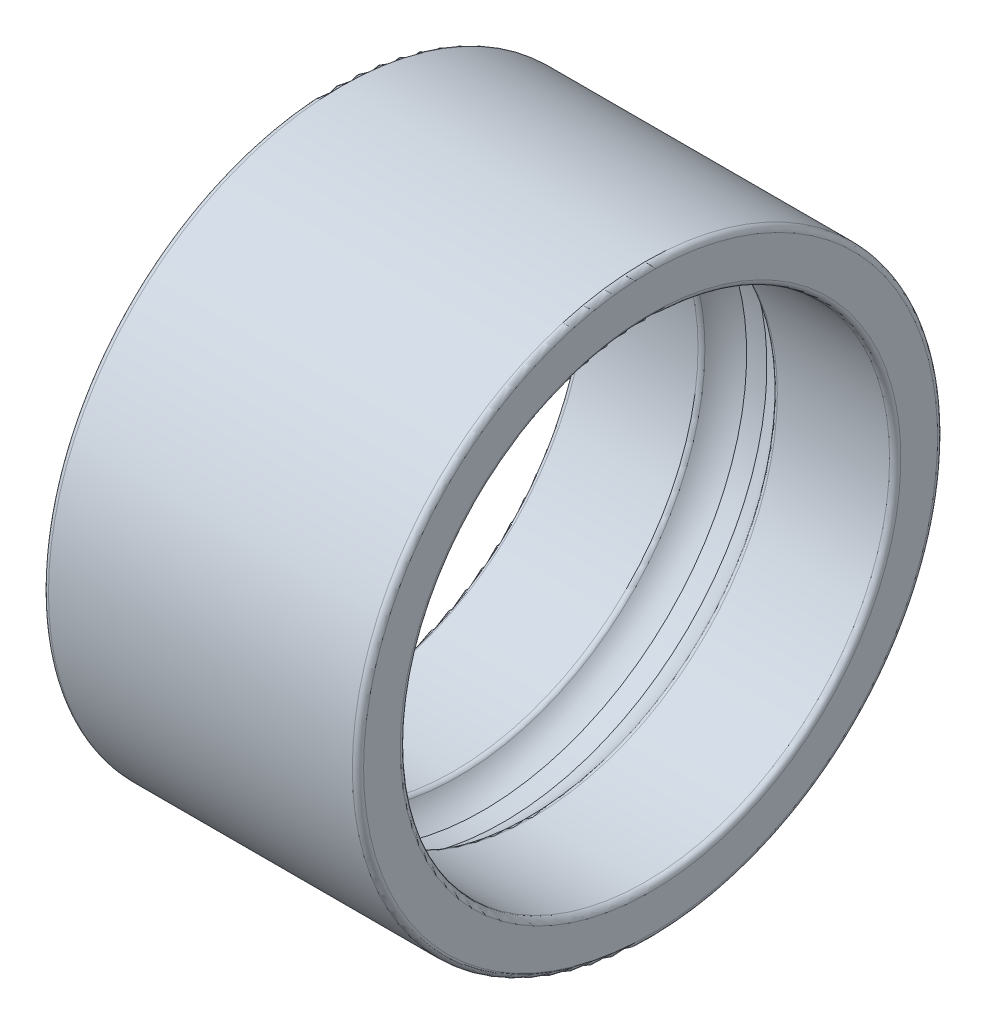
ISO-10303-21;
HEADER;
FILE_DESCRIPTION(('STEP AP214'),'2;1');
FILE_NAME('part.step','',(''),(''),'','','');
FILE_SCHEMA(('AUTOMOTIVE_DESIGN { 1 0 10303 214 1 1 1 1 }'));
ENDSEC;
DATA;
#1=APPLICATION_CONTEXT('core data for automotive mechanical design processes');
#2=APPLICATION_PROTOCOL_DEFINITION('international standard','automotive_design',2000,#1);
#3=PRODUCT_CONTEXT('',#1,'mechanical');
#4=PRODUCT('Part','Part','',(#3));
#5=PRODUCT_RELATED_PRODUCT_CATEGORY('part','',(#4));
#6=PRODUCT_DEFINITION_FORMATION('','',#4);
#7=PRODUCT_DEFINITION_CONTEXT('part definition',#1,'design');
#8=PRODUCT_DEFINITION('design','',#6,#7);
#9=PRODUCT_DEFINITION_SHAPE('','',#8);
#10=(LENGTH_UNIT() NAMED_UNIT(*) SI_UNIT(.MILLI.,.METRE.));
#11=(NAMED_UNIT(*) PLANE_ANGLE_UNIT() SI_UNIT($,.RADIAN.));
#12=(NAMED_UNIT(*) SI_UNIT($,.STERADIAN.) SOLID_ANGLE_UNIT());
#13=UNCERTAINTY_MEASURE_WITH_UNIT(LENGTH_MEASURE(1.E-05),#10,'distance_accuracy_value','');
#14=(GEOMETRIC_REPRESENTATION_CONTEXT(3) GLOBAL_UNCERTAINTY_ASSIGNED_CONTEXT((#13)) GLOBAL_UNIT_ASSIGNED_CONTEXT((#10,
#11,#12)) REPRESENTATION_CONTEXT('',''));
#15=CARTESIAN_POINT('',(0.,0.,0.));
#16=DIRECTION('',(0.,0.,1.));
#17=DIRECTION('',(1.,0.,0.));
#18=AXIS2_PLACEMENT_3D('',#15,#16,#17);
#19=CARTESIAN_POINT('',(0.,0.,0.));
#20=DIRECTION('',(-1.,0.,0.));
#21=DIRECTION('',(0.,0.,1.));
#22=AXIS2_PLACEMENT_3D('',#19,#20,#21);
#23=CYLINDRICAL_SURFACE('',#22,10.87);
#24=CARTESIAN_POINT('',(5.23794864059996,0.,0.));
#25=DIRECTION('',(1.,0.,0.));
#26=DIRECTION('',(0.,0.,-1.));
#27=AXIS2_PLACEMENT_3D('',#24,#25,#26);
#28=CIRCLE('',#27,10.87);
#29=CARTESIAN_POINT('',(5.23794864059996,0.,-10.87));
#30=VERTEX_POINT('',#29);
#31=EDGE_CURVE('E80',#30,#30,#28,.T.);
#32=ORIENTED_EDGE('',*,*,#31,.T.);
#33=EDGE_LOOP('',(#32));
#34=FACE_BOUND('',#33,.T.);
#35=CARTESIAN_POINT('',(0.25,0.,0.));
#36=DIRECTION('',(1.,0.,0.));
#37=DIRECTION('',(0.,0.,-1.));
#38=AXIS2_PLACEMENT_3D('',#35,#36,#37);
#39=CIRCLE('',#38,10.87);
#40=CARTESIAN_POINT('',(0.25,0.,-10.87));
#41=VERTEX_POINT('',#40);
#42=EDGE_CURVE('E84',#41,#41,#39,.F.);
#43=ORIENTED_EDGE('',*,*,#42,.T.);
#44=EDGE_LOOP('',(#43));
#45=FACE_BOUND('',#44,.T.);
#46=ADVANCED_FACE('F36',(#34,#45),#23,.F.);
#47=CARTESIAN_POINT('',(0.,10.87,0.));
#48=DIRECTION('',(1.,0.,0.));
#49=DIRECTION('',(0.,0.,-1.));
#50=AXIS2_PLACEMENT_3D('',#47,#48,#49);
#51=PLANE('',#50);
#52=CARTESIAN_POINT('',(0.,0.,0.));
#53=DIRECTION('',(1.,0.,0.));
#54=DIRECTION('',(0.,0.,-1.));
#55=AXIS2_PLACEMENT_3D('',#52,#53,#54);
#56=CIRCLE('',#55,11.12);
#57=CARTESIAN_POINT('',(0.,0.,-11.12));
#58=VERTEX_POINT('',#57);
#59=EDGE_CURVE('E49',#58,#58,#56,.T.);
#60=ORIENTED_EDGE('',*,*,#59,.T.);
#61=EDGE_LOOP('',(#60));
#62=FACE_BOUND('',#61,.T.);
#63=CARTESIAN_POINT('',(0.,0.,0.));
#64=DIRECTION('',(1.,0.,0.));
#65=DIRECTION('',(0.,0.,-1.));
#66=AXIS2_PLACEMENT_3D('',#63,#64,#65);
#67=CIRCLE('',#66,12.75);
#68=CARTESIAN_POINT('',(0.,0.,-12.75));
#69=VERTEX_POINT('',#68);
#70=EDGE_CURVE('E54',#69,#69,#67,.F.);
#71=ORIENTED_EDGE('',*,*,#70,.T.);
#72=EDGE_LOOP('',(#71));
#73=FACE_BOUND('',#72,.T.);
#74=ADVANCED_FACE('F119',(#62,#73),#51,.F.);
#75=CARTESIAN_POINT('',(0.,0.,0.));
#76=DIRECTION('',(-1.,0.,0.));
#77=DIRECTION('',(0.,0.,1.));
#78=AXIS2_PLACEMENT_3D('',#75,#76,#77);
#79=CYLINDRICAL_SURFACE('',#78,13.);
#80=CARTESIAN_POINT('',(0.25,0.,0.));
#81=DIRECTION('',(1.,0.,0.));
#82=DIRECTION('',(0.,0.,-1.));
#83=AXIS2_PLACEMENT_3D('',#80,#81,#82);
#84=CIRCLE('',#83,13.);
#85=CARTESIAN_POINT('',(0.25,0.,-13.));
#86=VERTEX_POINT('',#85);
#87=EDGE_CURVE('E10',#86,#86,#84,.T.);
#88=ORIENTED_EDGE('',*,*,#87,.T.);
#89=EDGE_LOOP('',(#88));
#90=FACE_BOUND('',#89,.T.);
#91=CARTESIAN_POINT('',(13.75,0.,0.));
#92=DIRECTION('',(-1.,0.,0.));
#93=DIRECTION('',(0.,0.,1.));
#94=AXIS2_PLACEMENT_3D('',#91,#92,#93);
#95=CIRCLE('',#94,13.);
#96=CARTESIAN_POINT('',(13.75,0.,13.));
#97=VERTEX_POINT('',#96);
#98=EDGE_CURVE('E44',#97,#97,#95,.T.);
#99=ORIENTED_EDGE('',*,*,#98,.T.);
#100=EDGE_LOOP('',(#99));
#101=FACE_BOUND('',#100,.T.);
#102=ADVANCED_FACE('F125',(#90,#101),#79,.T.);
#103=CARTESIAN_POINT('',(14.,13.,0.));
#104=DIRECTION('',(-1.,0.,0.));
#105=DIRECTION('',(0.,0.,1.));
#106=AXIS2_PLACEMENT_3D('',#103,#104,#105);
#107=PLANE('',#106);
#108=CARTESIAN_POINT('',(14.,0.,0.));
#109=DIRECTION('',(-1.,0.,0.));
#110=DIRECTION('',(0.,0.,1.));
#111=AXIS2_PLACEMENT_3D('',#108,#109,#110);
#112=CIRCLE('',#111,11.12);
#113=CARTESIAN_POINT('',(14.,0.,11.12));
#114=VERTEX_POINT('',#113);
#115=EDGE_CURVE('E60',#114,#114,#112,.T.);
#116=ORIENTED_EDGE('',*,*,#115,.T.);
#117=EDGE_LOOP('',(#116));
#118=FACE_BOUND('',#117,.T.);
#119=CARTESIAN_POINT('',(14.,0.,0.));
#120=DIRECTION('',(-1.,0.,0.));
#121=DIRECTION('',(0.,0.,1.));
#122=AXIS2_PLACEMENT_3D('',#119,#120,#121);
#123=CIRCLE('',#122,12.75);
#124=CARTESIAN_POINT('',(14.,0.,12.75));
#125=VERTEX_POINT('',#124);
#126=EDGE_CURVE('E64',#125,#125,#123,.F.);
#127=ORIENTED_EDGE('',*,*,#126,.T.);
#128=EDGE_LOOP('',(#127));
#129=FACE_BOUND('',#128,.T.);
#130=ADVANCED_FACE('F156',(#118,#129),#107,.F.);
#131=CARTESIAN_POINT('',(0.,0.,0.));
#132=DIRECTION('',(-1.,0.,0.));
#133=DIRECTION('',(0.,0.,1.));
#134=AXIS2_PLACEMENT_3D('',#131,#132,#133);
#135=CYLINDRICAL_SURFACE('',#134,10.87);
#136=CARTESIAN_POINT('',(8.76205135940004,0.,0.));
#137=DIRECTION('',(1.,0.,0.));
#138=DIRECTION('',(0.,0.,-1.));
#139=AXIS2_PLACEMENT_3D('',#136,#137,#138);
#140=CIRCLE('',#139,10.87);
#141=CARTESIAN_POINT('',(8.76205135940004,0.,-10.87));
#142=VERTEX_POINT('',#141);
#143=EDGE_CURVE('E72',#142,#142,#140,.F.);
#144=ORIENTED_EDGE('',*,*,#143,.T.);
#145=EDGE_LOOP('',(#144));
#146=FACE_BOUND('',#145,.T.);
#147=CARTESIAN_POINT('',(13.75,0.,0.));
#148=DIRECTION('',(-1.,0.,0.));
#149=DIRECTION('',(0.,0.,1.));
#150=AXIS2_PLACEMENT_3D('',#147,#148,#149);
#151=CIRCLE('',#150,10.87);
#152=CARTESIAN_POINT('',(13.75,0.,10.87));
#153=VERTEX_POINT('',#152);
#154=EDGE_CURVE('E76',#153,#153,#151,.F.);
#155=ORIENTED_EDGE('',*,*,#154,.T.);
#156=EDGE_LOOP('',(#155));
#157=FACE_BOUND('',#156,.T.);
#158=ADVANCED_FACE('F158',(#146,#157),#135,.F.);
#159=CARTESIAN_POINT('',(7.,0.,0.));
#160=DIRECTION('',(-1.,0.,0.));
#161=DIRECTION('',(0.,0.,1.));
#162=AXIS2_PLACEMENT_3D('',#159,#160,#161);
#163=TOROIDAL_SURFACE('',#162,9.85347917236373,1.92);
#164=CARTESIAN_POINT('',(8.55905005071338,0.,0.));
#165=DIRECTION('',(-1.,0.,0.));
#166=DIRECTION('',(0.,0.,1.));
#167=AXIS2_PLACEMENT_3D('',#164,#165,#166);
#168=CIRCLE('',#167,10.9740874622539);
#169=CARTESIAN_POINT('',(8.55905005071338,0.,10.9740874622539));
#170=VERTEX_POINT('',#169);
#171=EDGE_CURVE('E68',#170,#170,#168,.F.);
#172=ORIENTED_EDGE('',*,*,#171,.T.);
#173=EDGE_LOOP('',(#172));
#174=FACE_BOUND('',#173,.T.);
#175=CARTESIAN_POINT('',(7.45,0.,0.));
#176=DIRECTION('',(-1.,0.,0.));
#177=DIRECTION('',(0.,0.,1.));
#178=AXIS2_PLACEMENT_3D('',#175,#176,#177);
#179=CIRCLE('',#178,11.72);
#180=CARTESIAN_POINT('',(7.45,0.,11.72));
#181=VERTEX_POINT('',#180);
#182=EDGE_CURVE('E92',#181,#181,#179,.T.);
#183=ORIENTED_EDGE('',*,*,#182,.T.);
#184=EDGE_LOOP('',(#183));
#185=FACE_BOUND('',#184,.T.);
#186=ADVANCED_FACE('F115',(#174,#185),#163,.F.);
#187=CARTESIAN_POINT('',(0.,0.,0.));
#188=DIRECTION('',(-1.,0.,0.));
#189=DIRECTION('',(0.,0.,1.));
#190=AXIS2_PLACEMENT_3D('',#187,#188,#189);
#191=CYLINDRICAL_SURFACE('',#190,11.72);
#192=ORIENTED_EDGE('',*,*,#182,.F.);
#193=EDGE_LOOP('',(#192));
#194=FACE_BOUND('',#193,.T.);
#195=CARTESIAN_POINT('',(6.55,0.,0.));
#196=DIRECTION('',(-1.,0.,0.));
#197=DIRECTION('',(0.,0.,1.));
#198=AXIS2_PLACEMENT_3D('',#195,#196,#197);
#199=CIRCLE('',#198,11.72);
#200=CARTESIAN_POINT('',(6.55,0.,11.72));
#201=VERTEX_POINT('',#200);
#202=EDGE_CURVE('E96',#201,#201,#199,.T.);
#203=ORIENTED_EDGE('',*,*,#202,.T.);
#204=EDGE_LOOP('',(#203));
#205=FACE_BOUND('',#204,.T.);
#206=ADVANCED_FACE('F101',(#194,#205),#191,.F.);
#207=CARTESIAN_POINT('',(7.,0.,0.));
#208=DIRECTION('',(-1.,0.,0.));
#209=DIRECTION('',(0.,0.,1.));
#210=AXIS2_PLACEMENT_3D('',#207,#208,#209);
#211=TOROIDAL_SURFACE('',#210,9.85347917236373,1.92);
#212=CARTESIAN_POINT('',(5.44094994928659,0.,0.));
#213=DIRECTION('',(1.,0.,0.));
#214=DIRECTION('',(0.,0.,-1.));
#215=AXIS2_PLACEMENT_3D('',#212,#213,#214);
#216=CIRCLE('',#215,10.9740874622539);
#217=CARTESIAN_POINT('',(5.44094994928659,0.,-10.9740874622539));
#218=VERTEX_POINT('',#217);
#219=EDGE_CURVE('E88',#218,#218,#216,.F.);
#220=ORIENTED_EDGE('',*,*,#219,.T.);
#221=EDGE_LOOP('',(#220));
#222=FACE_BOUND('',#221,.T.);
#223=ORIENTED_EDGE('',*,*,#202,.F.);
#224=EDGE_LOOP('',(#223));
#225=FACE_BOUND('',#224,.T.);
#226=ADVANCED_FACE('F103',(#222,#225),#211,.F.);
#227=CARTESIAN_POINT('',(5.23794864059996,0.,0.));
#228=DIRECTION('',(1.,0.,0.));
#229=DIRECTION('',(0.,0.,-1.));
#230=AXIS2_PLACEMENT_3D('',#227,#228,#229);
#231=TOROIDAL_SURFACE('',#230,11.12,0.25);
#232=ORIENTED_EDGE('',*,*,#31,.F.);
#233=EDGE_LOOP('',(#232));
#234=FACE_BOUND('',#233,.T.);
#235=ORIENTED_EDGE('',*,*,#219,.F.);
#236=EDGE_LOOP('',(#235));
#237=FACE_BOUND('',#236,.T.);
#238=ADVANCED_FACE('F105',(#234,#237),#231,.T.);
#239=CARTESIAN_POINT('',(8.76205135940004,0.,0.));
#240=DIRECTION('',(1.,0.,0.));
#241=DIRECTION('',(0.,0.,-1.));
#242=AXIS2_PLACEMENT_3D('',#239,#240,#241);
#243=TOROIDAL_SURFACE('',#242,11.12,0.25);
#244=ORIENTED_EDGE('',*,*,#171,.F.);
#245=EDGE_LOOP('',(#244));
#246=FACE_BOUND('',#245,.T.);
#247=ORIENTED_EDGE('',*,*,#143,.F.);
#248=EDGE_LOOP('',(#247));
#249=FACE_BOUND('',#248,.T.);
#250=ADVANCED_FACE('F112',(#246,#249),#243,.T.);
#251=CARTESIAN_POINT('',(13.75,0.,0.));
#252=DIRECTION('',(-1.,0.,0.));
#253=DIRECTION('',(0.,0.,1.));
#254=AXIS2_PLACEMENT_3D('',#251,#252,#253);
#255=TOROIDAL_SURFACE('',#254,11.12,0.25);
#256=ORIENTED_EDGE('',*,*,#154,.F.);
#257=EDGE_LOOP('',(#256));
#258=FACE_BOUND('',#257,.T.);
#259=ORIENTED_EDGE('',*,*,#115,.F.);
#260=EDGE_LOOP('',(#259));
#261=FACE_BOUND('',#260,.T.);
#262=ADVANCED_FACE('F133',(#258,#261),#255,.T.);
#263=CARTESIAN_POINT('',(0.25,0.,0.));
#264=DIRECTION('',(1.,0.,0.));
#265=DIRECTION('',(0.,0.,-1.));
#266=AXIS2_PLACEMENT_3D('',#263,#264,#265);
#267=TOROIDAL_SURFACE('',#266,11.12,0.25);
#268=ORIENTED_EDGE('',*,*,#59,.F.);
#269=EDGE_LOOP('',(#268));
#270=FACE_BOUND('',#269,.T.);
#271=ORIENTED_EDGE('',*,*,#42,.F.);
#272=EDGE_LOOP('',(#271));
#273=FACE_BOUND('',#272,.T.);
#274=ADVANCED_FACE('F137',(#270,#273),#267,.T.);
#275=CARTESIAN_POINT('',(0.25,0.,0.));
#276=DIRECTION('',(1.,0.,0.));
#277=DIRECTION('',(0.,0.,-1.));
#278=AXIS2_PLACEMENT_3D('',#275,#276,#277);
#279=TOROIDAL_SURFACE('',#278,12.75,0.25);
#280=ORIENTED_EDGE('',*,*,#87,.F.);
#281=EDGE_LOOP('',(#280));
#282=FACE_BOUND('',#281,.T.);
#283=ORIENTED_EDGE('',*,*,#70,.F.);
#284=EDGE_LOOP('',(#283));
#285=FACE_BOUND('',#284,.T.);
#286=ADVANCED_FACE('F140',(#282,#285),#279,.T.);
#287=CARTESIAN_POINT('',(13.75,0.,0.));
#288=DIRECTION('',(-1.,0.,0.));
#289=DIRECTION('',(0.,0.,1.));
#290=AXIS2_PLACEMENT_3D('',#287,#288,#289);
#291=TOROIDAL_SURFACE('',#290,12.75,0.25);
#292=ORIENTED_EDGE('',*,*,#126,.F.);
#293=EDGE_LOOP('',(#292));
#294=FACE_BOUND('',#293,.T.);
#295=ORIENTED_EDGE('',*,*,#98,.F.);
#296=EDGE_LOOP('',(#295));
#297=FACE_BOUND('',#296,.T.);
#298=ADVANCED_FACE('F38',(#294,#297),#291,.T.);
#299=CLOSED_SHELL('',(#46,#74,#102,#130,#158,#186,#206,#226,#238,#250,#262,#274,#286,#298));
#300=MANIFOLD_SOLID_BREP('B2',#299);
#301=ADVANCED_BREP_SHAPE_REPRESENTATION('',(#18,#300),#14);
#302=SHAPE_DEFINITION_REPRESENTATION(#9,#301);
ENDSEC;
END-ISO-10303-21;
